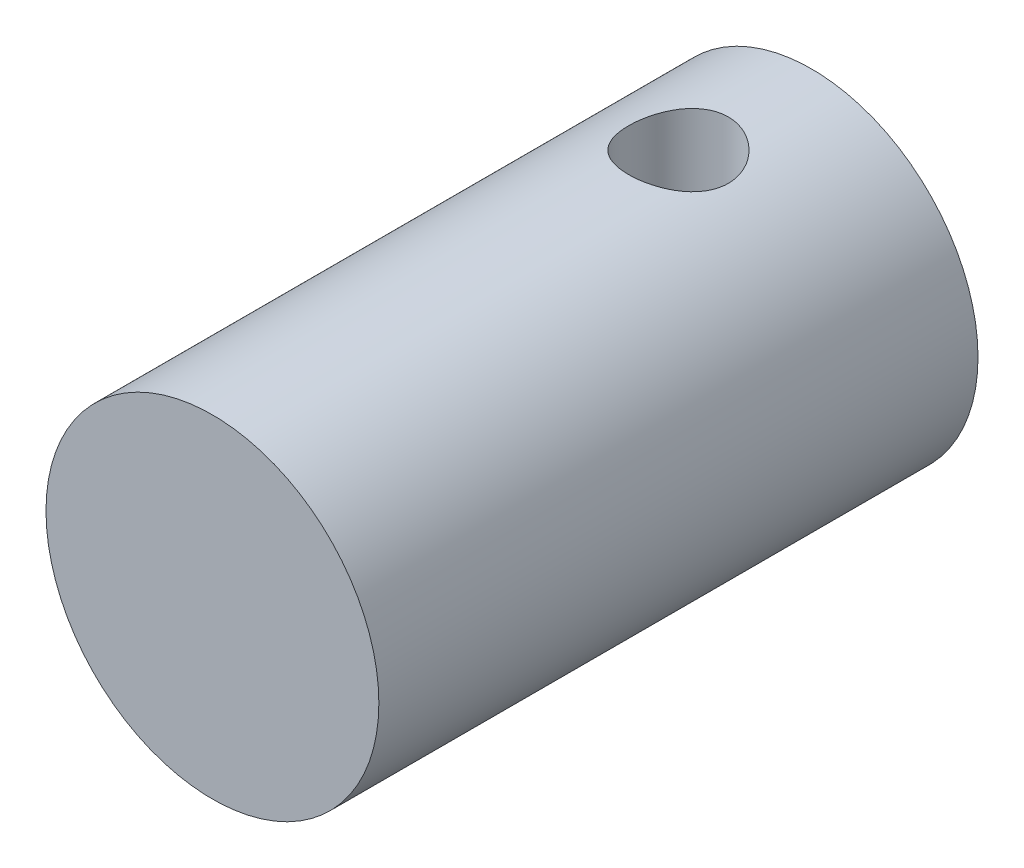
ISO-10303-21;
HEADER;
FILE_DESCRIPTION(('STEP AP214'),'2;1');
FILE_NAME('part.step','',(''),(''),'','','');
FILE_SCHEMA(('AUTOMOTIVE_DESIGN { 1 0 10303 214 1 1 1 1 }'));
ENDSEC;
DATA;
#1=APPLICATION_CONTEXT('core data for automotive mechanical design processes');
#2=APPLICATION_PROTOCOL_DEFINITION('international standard','automotive_design',2000,#1);
#3=PRODUCT_CONTEXT('',#1,'mechanical');
#4=PRODUCT('Part','Part','',(#3));
#5=PRODUCT_RELATED_PRODUCT_CATEGORY('part','',(#4));
#6=PRODUCT_DEFINITION_FORMATION('','',#4);
#7=PRODUCT_DEFINITION_CONTEXT('part definition',#1,'design');
#8=PRODUCT_DEFINITION('design','',#6,#7);
#9=PRODUCT_DEFINITION_SHAPE('','',#8);
#10=(LENGTH_UNIT() NAMED_UNIT(*) SI_UNIT(.MILLI.,.METRE.));
#11=(NAMED_UNIT(*) PLANE_ANGLE_UNIT() SI_UNIT($,.RADIAN.));
#12=(NAMED_UNIT(*) SI_UNIT($,.STERADIAN.) SOLID_ANGLE_UNIT());
#13=UNCERTAINTY_MEASURE_WITH_UNIT(LENGTH_MEASURE(1.E-05),#10,'distance_accuracy_value','');
#14=(GEOMETRIC_REPRESENTATION_CONTEXT(3) GLOBAL_UNCERTAINTY_ASSIGNED_CONTEXT((#13)) GLOBAL_UNIT_ASSIGNED_CONTEXT((#10,
#11,#12)) REPRESENTATION_CONTEXT('',''));
#15=CARTESIAN_POINT('',(0.,0.,0.));
#16=DIRECTION('',(0.,0.,1.));
#17=DIRECTION('',(1.,0.,0.));
#18=AXIS2_PLACEMENT_3D('',#15,#16,#17);
#19=CARTESIAN_POINT('',(-63.2013268027101,37.6957468467203,90.));
#20=DIRECTION('',(0.,0.,-1.));
#21=DIRECTION('',(-1.,0.,0.));
#22=AXIS2_PLACEMENT_3D('',#19,#20,#21);
#23=CYLINDRICAL_SURFACE('',#22,25.);
#24=CARTESIAN_POINT('',(-63.2013268027101,37.6957468467203,90.));
#25=DIRECTION('',(0.,0.,1.));
#26=DIRECTION('',(1.,0.,0.));
#27=AXIS2_PLACEMENT_3D('',#24,#25,#26);
#28=CIRCLE('',#27,25.);
#29=CARTESIAN_POINT('',(-38.2013268027101,37.6957468467203,90.));
#30=VERTEX_POINT('',#29);
#31=EDGE_CURVE('E10',#30,#30,#28,.T.);
#32=ORIENTED_EDGE('',*,*,#31,.F.);
#33=EDGE_LOOP('',(#32));
#34=FACE_BOUND('',#33,.T.);
#35=CARTESIAN_POINT('',(-63.2013268027101,37.6957468467203,0.));
#36=DIRECTION('',(0.,0.,1.));
#37=DIRECTION('',(1.,0.,0.));
#38=AXIS2_PLACEMENT_3D('',#35,#36,#37);
#39=CIRCLE('',#38,25.);
#40=CARTESIAN_POINT('',(-38.2013268027101,37.6957468467203,0.));
#41=VERTEX_POINT('',#40);
#42=EDGE_CURVE('E50',#41,#41,#39,.T.);
#43=ORIENTED_EDGE('',*,*,#42,.T.);
#44=EDGE_LOOP('',(#43));
#45=FACE_BOUND('',#44,.T.);
#46=CARTESIAN_POINT('',(-63.2013268027101,12.6957468467203,12.5));
#47=CARTESIAN_POINT('',(-62.9955974339308,12.695747108011,12.5000004112625));
#48=CARTESIAN_POINT('',(-62.7898609711749,12.6982923799865,12.5084719252444));
#49=CARTESIAN_POINT('',(-62.3798990925537,12.7084038894814,12.5422814878767));
#50=CARTESIAN_POINT('',(-62.1756737460615,12.7159703560873,12.5676203060797));
#51=CARTESIAN_POINT('',(-61.7702096946161,12.7359170074867,12.6349380110206));
#52=CARTESIAN_POINT('',(-61.5689711952961,12.748297522128,12.6769180379808));
#53=CARTESIAN_POINT('',(-61.1708535277715,12.7775398075142,12.7771655388596));
#54=CARTESIAN_POINT('',(-60.9739760012658,12.7944032358162,12.8354390377025));
#55=CARTESIAN_POINT('',(-60.5863607137283,12.832123188169,12.967661042412));
#56=CARTESIAN_POINT('',(-60.39561209458,12.8529721371817,13.0415798403282));
#57=CARTESIAN_POINT('',(-60.0210952750968,12.8981302632539,13.2045680555255));
#58=CARTESIAN_POINT('',(-59.8373297302777,12.9224407403026,13.2936431672761));
#59=CARTESIAN_POINT('',(-59.2984299661546,12.9996209757324,13.5825810978297));
#60=CARTESIAN_POINT('',(-58.9553343096142,13.0567761643035,13.8042794684374));
#61=CARTESIAN_POINT('',(-58.3018705201076,13.1782240134392,14.3061924306261));
#62=CARTESIAN_POINT('',(-57.9925780342825,13.2426630164643,14.5877718736252));
#63=CARTESIAN_POINT('',(-57.5669381295448,13.3385111621154,15.0454820043199));
#64=CARTESIAN_POINT('',(-57.4313710499723,13.3703444554789,15.2040486219919));
#65=CARTESIAN_POINT('',(-57.1738295929157,13.4328779822402,15.5320373219699));
#66=CARTESIAN_POINT('',(-57.0518501791471,13.4635786326127,15.7014553452715));
#67=CARTESIAN_POINT('',(-56.8196695635569,13.5236725580961,16.0541097017446));
#68=CARTESIAN_POINT('',(-56.7098025764061,13.5530197123196,16.2375738131813));
#69=CARTESIAN_POINT('',(-56.5060063094759,13.6087411771104,16.6135013477778));
#70=CARTESIAN_POINT('',(-56.4120711918069,13.6351165754191,16.8059614414353));
#71=CARTESIAN_POINT('',(-56.2408555848165,13.684087676665,17.19862263192));
#72=CARTESIAN_POINT('',(-56.1635751900706,13.7066833581386,17.3988237726978));
#73=CARTESIAN_POINT('',(-56.0263467771995,13.7473692335534,17.805526179363));
#74=CARTESIAN_POINT('',(-55.9663981416651,13.7654595879846,18.0120272205391));
#75=CARTESIAN_POINT('',(-55.8658181678275,13.7961024817296,18.4239310950328));
#76=CARTESIAN_POINT('',(-55.8246932067066,13.8087958228148,18.6292029529461));
#77=CARTESIAN_POINT('',(-55.7597272048449,13.8289549279996,19.0427152159302));
#78=CARTESIAN_POINT('',(-55.7358855497488,13.8364208779125,19.2509555152161));
#79=CARTESIAN_POINT('',(-55.7057174359843,13.845881202646,19.6687832401363));
#80=CARTESIAN_POINT('',(-55.6993874561043,13.8478766774576,19.8783703864527));
#81=CARTESIAN_POINT('',(-55.7042950414286,13.846333385685,20.2973159956704));
#82=CARTESIAN_POINT('',(-55.7155322277404,13.8427947384618,20.5066744634064));
#83=CARTESIAN_POINT('',(-55.7547361602654,13.8305276487439,20.9159742074959));
#84=CARTESIAN_POINT('',(-55.7820803267998,13.8219924106237,21.1159812968494));
#85=CARTESIAN_POINT('',(-55.8527470094262,13.8001459669981,21.5129552347268));
#86=CARTESIAN_POINT('',(-55.8960748551724,13.7868331684864,21.7099210463065));
#87=CARTESIAN_POINT('',(-55.9983224941954,13.7558308588945,22.0993440286104));
#88=CARTESIAN_POINT('',(-56.0572377461535,13.7381426226752,22.2918024947803));
#89=CARTESIAN_POINT('',(-56.1902133060235,13.6988909999937,22.6710838311216));
#90=CARTESIAN_POINT('',(-56.2642793342355,13.677326150258,22.8579045420503));
#91=CARTESIAN_POINT('',(-56.4280637833404,13.6306216310733,23.2271093020035));
#92=CARTESIAN_POINT('',(-56.5179775341871,13.6054381752684,23.4094011215487));
#93=CARTESIAN_POINT('',(-56.7121403458294,13.5524126683426,23.7658551504779));
#94=CARTESIAN_POINT('',(-56.8163943217889,13.5245697066708,23.9400145449099));
#95=CARTESIAN_POINT('',(-57.0385069041628,13.4669868974111,24.2791040345871));
#96=CARTESIAN_POINT('',(-57.1563659343295,13.4372469907526,24.4440338421238));
#97=CARTESIAN_POINT('',(-57.404930997202,13.3766564770987,24.76369509187));
#98=CARTESIAN_POINT('',(-57.5356373941492,13.3458058386281,24.918426244725));
#99=CARTESIAN_POINT('',(-57.8148427301455,13.2824896879976,25.2230496485502));
#100=CARTESIAN_POINT('',(-57.96385826155,13.2500107532923,25.3724660556632));
#101=CARTESIAN_POINT('',(-58.2739599871717,13.1856240243978,25.6582239578863));
#102=CARTESIAN_POINT('',(-58.4350422696507,13.1537160492377,25.7945696577963));
#103=CARTESIAN_POINT('',(-58.7683731251102,13.0913228752525,26.0533844420073));
#104=CARTESIAN_POINT('',(-58.940626598587,13.060838311063,26.1758473706948));
#105=CARTESIAN_POINT('',(-59.2950620180928,13.0021577072717,26.4059125570832));
#106=CARTESIAN_POINT('',(-59.4772400308052,12.9739607719029,26.5135206431883));
#107=CARTESIAN_POINT('',(-59.8517250807065,12.9204326751406,26.7138348498094));
#108=CARTESIAN_POINT('',(-60.0440951375497,12.8951234066688,26.8064291155219));
#109=CARTESIAN_POINT('',(-60.4363540377044,12.8483341252241,26.9749893417834));
#110=CARTESIAN_POINT('',(-60.6362399861585,12.8268526558479,27.0509616291902));
#111=CARTESIAN_POINT('',(-61.0421547500018,12.7883276125686,27.1856593933389));
#112=CARTESIAN_POINT('',(-61.2481833725196,12.7712838994893,27.2443854109631));
#113=CARTESIAN_POINT('',(-61.6648400006953,12.7421336397608,27.3440511345618));
#114=CARTESIAN_POINT('',(-61.8754678380969,12.730026912816,27.384991490061));
#115=CARTESIAN_POINT('',(-62.2920711038689,12.7114485612278,27.4475511606581));
#116=CARTESIAN_POINT('',(-62.4979421924557,12.7047902842955,27.4698111834193));
#117=CARTESIAN_POINT('',(-62.9109198555216,12.6965806013278,27.4972318892954));
#118=CARTESIAN_POINT('',(-63.1180263999355,12.6950290715219,27.5023929868313));
#119=CARTESIAN_POINT('',(-63.5319050532146,12.6970760889938,27.4955686635519));
#120=CARTESIAN_POINT('',(-63.7386771993883,12.7006740154149,27.4835853097995));
#121=CARTESIAN_POINT('',(-64.1503732137564,12.7129183162237,27.4425871577153));
#122=CARTESIAN_POINT('',(-64.3552970950133,12.7215646549038,27.4135724798468));
#123=CARTESIAN_POINT('',(-64.7571546669681,12.7434128857745,27.3396311049056));
#124=CARTESIAN_POINT('',(-64.954163996976,12.7565063822966,27.2950824044168));
#125=CARTESIAN_POINT('',(-65.3437091026506,12.7869455732993,27.1903331953074));
#126=CARTESIAN_POINT('',(-65.5362433546916,12.8042926934463,27.1301274385769));
#127=CARTESIAN_POINT('',(-65.9154505618262,12.8427822984096,26.994574042881));
#128=CARTESIAN_POINT('',(-66.1021250841843,12.8639237580389,26.9192304933182));
#129=CARTESIAN_POINT('',(-66.4685559141294,12.9094740621228,26.7539343959032));
#130=CARTESIAN_POINT('',(-66.6483095831104,12.9338841371764,26.6639763431125));
#131=CARTESIAN_POINT('',(-67.0037363003487,12.9859375808187,26.4679059464763));
#132=CARTESIAN_POINT('',(-67.1792232270303,13.0136419169977,26.361472401944));
#133=CARTESIAN_POINT('',(-67.5207175184221,13.0711075508809,26.1347280654955));
#134=CARTESIAN_POINT('',(-67.6867215768243,13.100869558117,26.0144124770717));
#135=CARTESIAN_POINT('',(-68.0081952100468,13.1616729458461,25.7607242511056));
#136=CARTESIAN_POINT('',(-68.1636642493753,13.1927143912437,25.6273509506849));
#137=CARTESIAN_POINT('',(-68.46312960672,13.255271498429,25.348393039342));
#138=CARTESIAN_POINT('',(-68.6071257035207,13.2867871693465,25.202808193074));
#139=CARTESIAN_POINT('',(-68.8878122121842,13.3506168932327,24.894779861594));
#140=CARTESIAN_POINT('',(-69.0240432323072,13.3829180248464,24.7319146788211));
#141=CARTESIAN_POINT('',(-69.2822751865641,13.4462161294408,24.3951201087598));
#142=CARTESIAN_POINT('',(-69.4042809174817,13.4772135397708,24.2211944818166));
#143=CARTESIAN_POINT('',(-69.6332960149577,13.5370260711218,23.8632790647772));
#144=CARTESIAN_POINT('',(-69.7402996651257,13.5658403583743,23.6792854753124));
#145=CARTESIAN_POINT('',(-69.9384036238113,13.6203994222174,23.3025842463297));
#146=CARTESIAN_POINT('',(-70.0295104663149,13.6461454585501,23.1098802282167));
#147=CARTESIAN_POINT('',(-70.1947782045566,13.6936843281958,22.7178470275202));
#148=CARTESIAN_POINT('',(-70.2690100754981,13.7154936362569,22.5185497897928));
#149=CARTESIAN_POINT('',(-70.4003561921086,13.7545965946545,22.1140423381271));
#150=CARTESIAN_POINT('',(-70.4574771755127,13.7718920220705,21.9088344865881));
#151=CARTESIAN_POINT('',(-70.5541091167229,13.8014138580361,21.4939710842057));
#152=CARTESIAN_POINT('',(-70.5936216572219,13.8136407221546,21.2843159348725));
#153=CARTESIAN_POINT('',(-70.654658917241,13.8326190740685,20.8621602230154));
#154=CARTESIAN_POINT('',(-70.6761843221537,13.8393707704926,20.6496597692243));
#155=CARTESIAN_POINT('',(-70.7005157682562,13.8470086000164,20.2323894168999));
#156=CARTESIAN_POINT('',(-70.7040651519327,13.8481276415819,20.0276667726657));
#157=CARTESIAN_POINT('',(-70.6944183026481,13.845094729384,19.6186566305787));
#158=CARTESIAN_POINT('',(-70.6812223185737,13.8409428539623,19.4143691263037));
#159=CARTESIAN_POINT('',(-70.6382087329973,13.8274982273256,19.0077365103332));
#160=CARTESIAN_POINT('',(-70.6083920056289,13.8182057464703,18.8053912970562));
#161=CARTESIAN_POINT('',(-70.5324081326086,13.794767283605,18.4040824484149));
#162=CARTESIAN_POINT('',(-70.4862409110428,13.7806212790605,18.2051188287555));
#163=CARTESIAN_POINT('',(-70.3786439988405,13.7481116671036,17.8144449801132));
#164=CARTESIAN_POINT('',(-70.317414636119,13.7298036398133,17.6226748519841));
#165=CARTESIAN_POINT('',(-70.1798783427527,13.6893944973931,17.244963027346));
#166=CARTESIAN_POINT('',(-70.1035663605265,13.6672921117557,17.0590233078415));
#167=CARTESIAN_POINT('',(-69.9364693751069,13.6199210158073,16.694232849456));
#168=CARTESIAN_POINT('',(-69.8456871471616,13.5946529128475,16.5153807594349));
#169=CARTESIAN_POINT('',(-69.6502448816278,13.5416228230554,16.1657354366646));
#170=CARTESIAN_POINT('',(-69.5455798826076,13.5138599457887,15.9949451147601));
#171=CARTESIAN_POINT('',(-69.3190478311056,13.4555394275603,15.656446987065));
#172=CARTESIAN_POINT('',(-69.1966946116978,13.4249169480947,15.4890755589508));
#173=CARTESIAN_POINT('',(-68.9386649275107,13.3626302854606,15.1651440310784));
#174=CARTESIAN_POINT('',(-68.802988109558,13.3309660746934,15.0085842180949));
#175=CARTESIAN_POINT('',(-68.5191163938813,13.2674380251865,14.7071757957806));
#176=CARTESIAN_POINT('',(-68.3709163697093,13.2355741096865,14.562332030434));
#177=CARTESIAN_POINT('',(-68.0630158762154,13.1725198564665,14.2853835022133));
#178=CARTESIAN_POINT('',(-67.9033192671986,13.1413292971786,14.1532744978109));
#179=CARTESIAN_POINT('',(-67.5684578460502,13.079532682713,13.8988789845925));
#180=CARTESIAN_POINT('',(-67.3929746828869,13.0489714237631,13.7770001817583));
#181=CARTESIAN_POINT('',(-67.0320200843291,12.9902979804543,13.5485356366457));
#182=CARTESIAN_POINT('',(-66.8465523058934,12.9621849091668,13.4419443468825));
#183=CARTESIAN_POINT('',(-66.466857656197,12.9091972466788,13.244849931559));
#184=CARTESIAN_POINT('',(-66.2726325456454,12.8843220083689,13.1543435899559));
#185=CARTESIAN_POINT('',(-65.8767576058818,12.838519407473,12.9901514004289));
#186=CARTESIAN_POINT('',(-65.6751084953352,12.8175916639524,12.9164639293341));
#187=CARTESIAN_POINT('',(-65.2878092993404,12.7822915665747,12.7935214289626));
#188=CARTESIAN_POINT('',(-65.1027617973027,12.7674569459212,12.7424939325794));
#189=CARTESIAN_POINT('',(-64.7290398681018,12.741765913242,12.6547342900006));
#190=CARTESIAN_POINT('',(-64.5403656604146,12.7309092612755,12.6180012815905));
#191=CARTESIAN_POINT('',(-64.1605494719846,12.7134324217152,12.559111214488));
#192=CARTESIAN_POINT('',(-63.969407351971,12.7068124742849,12.5369549820987));
#193=CARTESIAN_POINT('',(-63.5859541973392,12.6979703411762,12.5074017886911));
#194=CARTESIAN_POINT('',(-63.3936435995958,12.6957466024644,12.4999996155498));
#195=CARTESIAN_POINT('',(-63.2013268027101,12.6957468467203,12.5));
#196=B_SPLINE_CURVE_WITH_KNOTS('',3,(#46,#47,#48,#49,#50,#51,#52,#53,#54,#55,#56,#57,#58,#59,
#60,#61,#62,#63,#64,#65,#66,#67,#68,#69,#70,#71,#72,#73,#74,#75,#76,#77,#78,#79,#80,#81,#82,#83,
#84,#85,#86,#87,#88,#89,#90,#91,#92,#93,#94,#95,#96,#97,#98,#99,#100,#101,#102,#103,#104,#105,
#106,#107,#108,#109,#110,#111,#112,#113,#114,#115,#116,#117,#118,#119,#120,#121,#122,#123,#124,
#125,#126,#127,#128,#129,#130,#131,#132,#133,#134,#135,#136,#137,#138,#139,#140,#141,#142,#143,
#144,#145,#146,#147,#148,#149,#150,#151,#152,#153,#154,#155,#156,#157,#158,#159,#160,#161,#162,
#163,#164,#165,#166,#167,#168,#169,#170,#171,#172,#173,#174,#175,#176,#177,#178,#179,#180,#181,
#182,#183,#184,#185,#186,#187,#188,#189,#190,#191,#192,#193,#194,#195),.UNSPECIFIED.,.T.,.F.,(4,
2,2,2,2,2,2,2,2,2,2,2,2,2,2,2,2,2,2,2,2,2,2,2,2,2,2,2,2,2,2,2,2,2,2,2,2,2,2,2,2,2,2,2,2,2,2,2,2,
2,2,2,2,2,2,2,2,2,2,2,2,2,2,2,2,2,2,2,2,2,2,2,2,2,4),(0.,0.617011014084921,1.23405018056197,
1.85113163263338,2.46844156866762,3.08458968130544,3.70096980389295,4.93260224445208,
6.19608156979814,6.82858532893179,7.4608538641903,8.10762051119977,8.75414965009407,
9.40068246026767,10.0471922361636,10.6756103415585,11.304006108008,11.9322755087511,
12.5605313590348,13.1659639935605,13.7715986884165,14.3770571283423,14.9827445874104,
15.5964989646348,16.2104642350319,16.8244486335694,17.4384504444769,18.0782287707322,
18.7178005870157,19.357654888987,19.9972574216116,20.6414255082747,21.2853479756983,
21.9292502460878,22.573128999469,23.1938985328161,23.8146530206626,24.4353326720282,
25.0560079333493,25.6625274932798,26.2692506159497,26.8758100551044,27.4825985028951,
28.1032039409232,28.7240244556025,29.3448765027644,29.9657405179864,30.6092972595381,
31.2526363615572,31.8962199390125,32.5395383611583,33.1800987847127,33.8204066429376,
34.4606569370019,35.1008828334693,35.7144046773518,36.3279174025609,36.9413978643795,
37.5548811745697,38.1606087791624,38.7665396033302,39.3723543555586,39.9783862004705,
40.6063948225765,41.234420096027,41.8627037124137,42.4907773399551,43.1374850516323,
43.7839574910374,44.4303005282366,45.0765811611782,45.6535719780474,46.2305279866003,
46.8075166978202,47.3843015417932),.UNSPECIFIED.);
#197=CARTESIAN_POINT('',(-63.2013268027101,12.6957468467203,12.5));
#198=VERTEX_POINT('',#197);
#199=EDGE_CURVE('E57',#198,#198,#196,.T.);
#200=ORIENTED_EDGE('',*,*,#199,.F.);
#201=EDGE_LOOP('',(#200));
#202=FACE_BOUND('',#201,.T.);
#203=CARTESIAN_POINT('',(-63.2013268027101,62.6957468467203,12.5));
#204=CARTESIAN_POINT('',(-63.4070561714894,62.6957465854295,12.5000004112625));
#205=CARTESIAN_POINT('',(-63.6127926342454,62.6932013134541,12.5084719252444));
#206=CARTESIAN_POINT('',(-64.0227545128665,62.6830898039592,12.5422814878767));
#207=CARTESIAN_POINT('',(-64.2269798593587,62.6755233373532,12.5676203060797));
#208=CARTESIAN_POINT('',(-64.6324439108041,62.6555766859538,12.6349380110206));
#209=CARTESIAN_POINT('',(-64.8336824101241,62.6431961713125,12.6769180379807));
#210=CARTESIAN_POINT('',(-65.2318000776488,62.6139538859263,12.7771655388596));
#211=CARTESIAN_POINT('',(-65.4286776041544,62.5970904576243,12.8354390377025));
#212=CARTESIAN_POINT('',(-65.8162928916919,62.5593705052715,12.967661042412));
#213=CARTESIAN_POINT('',(-66.0070415108402,62.5385215562588,13.0415798403282));
#214=CARTESIAN_POINT('',(-66.3815583303234,62.4933634301866,13.2045680555255));
#215=CARTESIAN_POINT('',(-66.5653238751425,62.4690529531379,13.2936431672761));
#216=CARTESIAN_POINT('',(-67.1042236392656,62.3918727177082,13.5825810978297));
#217=CARTESIAN_POINT('',(-67.447319295806,62.334717529137,13.8042794684374));
#218=CARTESIAN_POINT('',(-68.1007830853126,62.2132696800014,14.3061924306261));
#219=CARTESIAN_POINT('',(-68.4100755711377,62.1488306769763,14.5877718736252));
#220=CARTESIAN_POINT('',(-68.8357154758754,62.0529825313251,15.0454820043199));
#221=CARTESIAN_POINT('',(-68.9712825554479,62.0211492379617,15.2040486219919));
#222=CARTESIAN_POINT('',(-69.2288240125045,61.9586157112003,15.5320373219699));
#223=CARTESIAN_POINT('',(-69.3508034262731,61.9279150608278,15.7014553452715));
#224=CARTESIAN_POINT('',(-69.5829840418633,61.8678211353445,16.0541097017446));
#225=CARTESIAN_POINT('',(-69.6928510290142,61.8384739811209,16.2375738131813));
#226=CARTESIAN_POINT('',(-69.8966472959443,61.7827525163301,16.6135013477778));
#227=CARTESIAN_POINT('',(-69.9905824136134,61.7563771180214,16.8059614414353));
#228=CARTESIAN_POINT('',(-70.1617980206037,61.7074060167755,17.19862263192));
#229=CARTESIAN_POINT('',(-70.2390784153497,61.6848103353019,17.3988237726978));
#230=CARTESIAN_POINT('',(-70.3763068282207,61.6441244598872,17.8055261793629));
#231=CARTESIAN_POINT('',(-70.4362554637551,61.626034105456,18.0120272205391));
#232=CARTESIAN_POINT('',(-70.5368354375927,61.5953912117109,18.4239310950328));
#233=CARTESIAN_POINT('',(-70.5779603987136,61.5826978706257,18.6292029529461));
#234=CARTESIAN_POINT('',(-70.6429264005754,61.562538765441,19.0427152159302));
#235=CARTESIAN_POINT('',(-70.6667680556714,61.5550728155281,19.2509555152161));
#236=CARTESIAN_POINT('',(-70.696936169436,61.5456124907946,19.6687832401363));
#237=CARTESIAN_POINT('',(-70.7032661493159,61.5436170159829,19.8783703864527));
#238=CARTESIAN_POINT('',(-70.6983585639917,61.5451603077555,20.2973159956704));
#239=CARTESIAN_POINT('',(-70.6871213776798,61.5486989549787,20.5066744634064));
#240=CARTESIAN_POINT('',(-70.6479174451548,61.5609660446967,20.9159742074959));
#241=CARTESIAN_POINT('',(-70.6205732786204,61.5695012828168,21.1159812968494));
#242=CARTESIAN_POINT('',(-70.549906595994,61.5913477264424,21.5129552347268));
#243=CARTESIAN_POINT('',(-70.5065787502478,61.6046605249541,21.7099210463065));
#244=CARTESIAN_POINT('',(-70.4043311112249,61.6356628345461,22.0993440286103));
#245=CARTESIAN_POINT('',(-70.3454158592667,61.6533510707654,22.2918024947802));
#246=CARTESIAN_POINT('',(-70.2124402993967,61.6926026934469,22.6710838311216));
#247=CARTESIAN_POINT('',(-70.1383742711847,61.7141675431826,22.8579045420503));
#248=CARTESIAN_POINT('',(-69.9745898220798,61.7608720623672,23.2271093020035));
#249=CARTESIAN_POINT('',(-69.8846760712331,61.7860555181721,23.4094011215487));
#250=CARTESIAN_POINT('',(-69.6905132595908,61.8390810250979,23.7658551504779));
#251=CARTESIAN_POINT('',(-69.5862592836313,61.8669239867698,23.9400145449099));
#252=CARTESIAN_POINT('',(-69.3641467012574,61.9245067960295,24.2791040345871));
#253=CARTESIAN_POINT('',(-69.2462876710908,61.954246702688,24.4440338421237));
#254=CARTESIAN_POINT('',(-68.9977226082183,62.0148372163419,24.7636950918699));
#255=CARTESIAN_POINT('',(-68.867016211271,62.0456878548124,24.918426244725));
#256=CARTESIAN_POINT('',(-68.5878108752748,62.109004005443,25.2230496485502));
#257=CARTESIAN_POINT('',(-68.4387953438703,62.1414829401482,25.3724660556632));
#258=CARTESIAN_POINT('',(-68.1286936182486,62.2058696690427,25.6582239578862));
#259=CARTESIAN_POINT('',(-67.9676113357696,62.2377776442028,25.7945696577963));
#260=CARTESIAN_POINT('',(-67.6342804803101,62.300170818188,26.0533844420073));
#261=CARTESIAN_POINT('',(-67.4620270068333,62.3306553823775,26.1758473706948));
#262=CARTESIAN_POINT('',(-67.1075915873275,62.3893359861688,26.4059125570832));
#263=CARTESIAN_POINT('',(-66.925413574615,62.4175329215377,26.5135206431882));
#264=CARTESIAN_POINT('',(-66.5509285247138,62.4710610182999,26.7138348498094));
#265=CARTESIAN_POINT('',(-66.3585584678706,62.4963702867717,26.8064291155219));
#266=CARTESIAN_POINT('',(-65.9662995677158,62.5431595682165,26.9749893417834));
#267=CARTESIAN_POINT('',(-65.7664136192617,62.5646410375927,27.0509616291902));
#268=CARTESIAN_POINT('',(-65.3604988554184,62.603166080872,27.1856593933389));
#269=CARTESIAN_POINT('',(-65.1544702329007,62.6202097939513,27.2443854109631));
#270=CARTESIAN_POINT('',(-64.7378136047249,62.6493600536798,27.3440511345618));
#271=CARTESIAN_POINT('',(-64.5271857673233,62.6614667806245,27.384991490061));
#272=CARTESIAN_POINT('',(-64.1105825015513,62.6800451322128,27.4475511606581));
#273=CARTESIAN_POINT('',(-63.9047114129646,62.686703409145,27.4698111834193));
#274=CARTESIAN_POINT('',(-63.4917337498987,62.6949130921127,27.4972318892954));
#275=CARTESIAN_POINT('',(-63.2846272054848,62.6964646219187,27.5023929868313));
#276=CARTESIAN_POINT('',(-62.8707485522057,62.6944176044467,27.4955686635519));
#277=CARTESIAN_POINT('',(-62.663976406032,62.6908196780257,27.4835853097996));
#278=CARTESIAN_POINT('',(-62.2522803916638,62.6785753772169,27.4425871577153));
#279=CARTESIAN_POINT('',(-62.047356510407,62.6699290385367,27.4135724798468));
#280=CARTESIAN_POINT('',(-61.6454989384521,62.648080807666,27.3396311049056));
#281=CARTESIAN_POINT('',(-61.4484896084442,62.634987311144,27.2950824044168));
#282=CARTESIAN_POINT('',(-61.0589445027697,62.6045481201413,27.1903331953074));
#283=CARTESIAN_POINT('',(-60.8664102507286,62.5872009999942,27.1301274385769));
#284=CARTESIAN_POINT('',(-60.487203043594,62.5487113950309,26.994574042881));
#285=CARTESIAN_POINT('',(-60.3005285212359,62.5275699354017,26.9192304933182));
#286=CARTESIAN_POINT('',(-59.9340976912909,62.4820196313177,26.7539343959032));
#287=CARTESIAN_POINT('',(-59.7543440223098,62.4576095562641,26.6639763431125));
#288=CARTESIAN_POINT('',(-59.3989173050715,62.4055561126219,26.4679059464763));
#289=CARTESIAN_POINT('',(-59.2234303783899,62.3778517764428,26.361472401944));
#290=CARTESIAN_POINT('',(-58.8819360869981,62.3203861425596,26.1347280654955));
#291=CARTESIAN_POINT('',(-58.7159320285959,62.2906241353236,26.0144124770717));
#292=CARTESIAN_POINT('',(-58.3944583953734,62.2298207475945,25.7607242511056));
#293=CARTESIAN_POINT('',(-58.2389893560449,62.1987793021969,25.6273509506849));
#294=CARTESIAN_POINT('',(-57.9395239987002,62.1362221950115,25.348393039342));
#295=CARTESIAN_POINT('',(-57.7955279018995,62.104706524094,25.202808193074));
#296=CARTESIAN_POINT('',(-57.514841393236,62.0408768002078,24.894779861594));
#297=CARTESIAN_POINT('',(-57.3786103731131,62.0085756685942,24.7319146788211));
#298=CARTESIAN_POINT('',(-57.1203784188561,61.9452775639998,24.3951201087598));
#299=CARTESIAN_POINT('',(-56.9983726879385,61.9142801536698,24.2211944818166));
#300=CARTESIAN_POINT('',(-56.7693575904625,61.8544676223188,23.8632790647772));
#301=CARTESIAN_POINT('',(-56.6623539402946,61.8256533350663,23.6792854753124));
#302=CARTESIAN_POINT('',(-56.4642499816089,61.7710942712231,23.3025842463297));
#303=CARTESIAN_POINT('',(-56.3731431391053,61.7453482348904,23.1098802282167));
#304=CARTESIAN_POINT('',(-56.2078754008636,61.6978093652447,22.7178470275203));
#305=CARTESIAN_POINT('',(-56.1336435299222,61.6760000571837,22.5185497897929));
#306=CARTESIAN_POINT('',(-56.0022974133116,61.6368970987861,22.1140423381271));
#307=CARTESIAN_POINT('',(-55.9451764299075,61.6196016713701,21.9088344865881));
#308=CARTESIAN_POINT('',(-55.8485444886973,61.5900798354044,21.4939710842058));
#309=CARTESIAN_POINT('',(-55.8090319481983,61.5778529712859,21.2843159348725));
#310=CARTESIAN_POINT('',(-55.7479946881792,61.5588746193721,20.8621602230154));
#311=CARTESIAN_POINT('',(-55.7264692832665,61.5521229229479,20.6496597692243));
#312=CARTESIAN_POINT('',(-55.702137837164,61.5444850934241,20.2323894168999));
#313=CARTESIAN_POINT('',(-55.6985884534876,61.5433660518587,20.0276667726657));
#314=CARTESIAN_POINT('',(-55.7082353027721,61.5463989640566,19.6186566305787));
#315=CARTESIAN_POINT('',(-55.7214312868465,61.5505508394783,19.4143691263037));
#316=CARTESIAN_POINT('',(-55.7644448724229,61.563995466115,19.0077365103332));
#317=CARTESIAN_POINT('',(-55.7942615997913,61.5732879469703,18.8053912970562));
#318=CARTESIAN_POINT('',(-55.8702454728116,61.5967264098356,18.4040824484149));
#319=CARTESIAN_POINT('',(-55.9164126943774,61.61087241438,18.2051188287555));
#320=CARTESIAN_POINT('',(-56.0240096065797,61.6433820263369,17.8144449801132));
#321=CARTESIAN_POINT('',(-56.0852389693012,61.6616900536273,17.6226748519841));
#322=CARTESIAN_POINT('',(-56.2227752626675,61.7020991960475,17.244963027346));
#323=CARTESIAN_POINT('',(-56.2990872448937,61.7242015816848,17.0590233078415));
#324=CARTESIAN_POINT('',(-56.4661842303133,61.7715726776332,16.694232849456));
#325=CARTESIAN_POINT('',(-56.5569664582586,61.796840780593,16.515380759435));
#326=CARTESIAN_POINT('',(-56.7524087237924,61.8498708703852,16.1657354366646));
#327=CARTESIAN_POINT('',(-56.8570737228126,61.8776337476518,15.9949451147601));
#328=CARTESIAN_POINT('',(-57.0836057743146,61.9359542658802,15.656446987065));
#329=CARTESIAN_POINT('',(-57.2059589937224,61.9665767453459,15.4890755589508));
#330=CARTESIAN_POINT('',(-57.4639886779095,62.02886340798,15.1651440310784));
#331=CARTESIAN_POINT('',(-57.5996654958622,62.0605276187472,15.0085842180949));
#332=CARTESIAN_POINT('',(-57.8835372115389,62.124055668254,14.7071757957806));
#333=CARTESIAN_POINT('',(-58.0317372357109,62.1559195837541,14.562332030434));
#334=CARTESIAN_POINT('',(-58.3396377292048,62.2189738369741,14.2853835022133));
#335=CARTESIAN_POINT('',(-58.4993343382216,62.250164396262,14.1532744978109));
#336=CARTESIAN_POINT('',(-58.83419575937,62.3119610107275,13.8988789845925));
#337=CARTESIAN_POINT('',(-59.0096789225333,62.3425222696775,13.7770001817583));
#338=CARTESIAN_POINT('',(-59.3706335210911,62.4011957129863,13.5485356366457));
#339=CARTESIAN_POINT('',(-59.5561012995268,62.4293087842737,13.4419443468825));
#340=CARTESIAN_POINT('',(-59.9357959492232,62.4822964467618,13.244849931559));
#341=CARTESIAN_POINT('',(-60.1300210597748,62.5071716850716,13.1543435899559));
#342=CARTESIAN_POINT('',(-60.5258959995383,62.5529742859675,12.9901514004289));
#343=CARTESIAN_POINT('',(-60.727545110085,62.5739020294881,12.9164639293341));
#344=CARTESIAN_POINT('',(-61.1148443060798,62.6092021268659,12.7935214289626));
#345=CARTESIAN_POINT('',(-61.2998918081174,62.6240367475194,12.7424939325794));
#346=CARTESIAN_POINT('',(-61.6736137373184,62.6497277801986,12.6547342900006));
#347=CARTESIAN_POINT('',(-61.8622879450056,62.660584432165,12.6180012815905));
#348=CARTESIAN_POINT('',(-62.2421041334356,62.6780612717253,12.559111214488));
#349=CARTESIAN_POINT('',(-62.4332462534492,62.6846812191556,12.5369549820987));
#350=CARTESIAN_POINT('',(-62.816699408081,62.6935233522643,12.5074017886911));
#351=CARTESIAN_POINT('',(-63.0090100058244,62.6957470909761,12.4999996155498));
#352=CARTESIAN_POINT('',(-63.2013268027101,62.6957468467203,12.5));
#353=B_SPLINE_CURVE_WITH_KNOTS('',3,(#203,#204,#205,#206,#207,#208,#209,#210,#211,#212,#213,
#214,#215,#216,#217,#218,#219,#220,#221,#222,#223,#224,#225,#226,#227,#228,#229,#230,#231,#232,
#233,#234,#235,#236,#237,#238,#239,#240,#241,#242,#243,#244,#245,#246,#247,#248,#249,#250,#251,
#252,#253,#254,#255,#256,#257,#258,#259,#260,#261,#262,#263,#264,#265,#266,#267,#268,#269,#270,
#271,#272,#273,#274,#275,#276,#277,#278,#279,#280,#281,#282,#283,#284,#285,#286,#287,#288,#289,
#290,#291,#292,#293,#294,#295,#296,#297,#298,#299,#300,#301,#302,#303,#304,#305,#306,#307,#308,
#309,#310,#311,#312,#313,#314,#315,#316,#317,#318,#319,#320,#321,#322,#323,#324,#325,#326,#327,
#328,#329,#330,#331,#332,#333,#334,#335,#336,#337,#338,#339,#340,#341,#342,#343,#344,#345,#346,
#347,#348,#349,#350,#351,#352),.UNSPECIFIED.,.T.,.F.,(4,2,2,2,2,2,2,2,2,2,2,2,2,2,2,2,2,2,2,2,2,
2,2,2,2,2,2,2,2,2,2,2,2,2,2,2,2,2,2,2,2,2,2,2,2,2,2,2,2,2,2,2,2,2,2,2,2,2,2,2,2,2,2,2,2,2,2,2,2,
2,2,2,2,2,4),(0.,0.617011014084921,1.23405018056197,1.85113163263337,2.46844156866762,
3.08458968130542,3.70096980389294,4.93260224445208,6.19608156979814,6.82858532893178,
7.46085386419029,8.10762051119976,8.75414965009406,9.40068246026766,10.0471922361636,
10.6756103415585,11.3040061080079,11.9322755087511,12.5605313590348,13.1659639935605,
13.7715986884165,14.3770571283422,14.9827445874104,15.5964989646348,16.2104642350319,
16.8244486335694,17.4384504444769,18.0782287707322,18.7178005870157,19.357654888987,
19.9972574216116,20.6414255082747,21.2853479756983,21.9292502460877,22.573128999469,
23.193898532816,23.8146530206626,24.4353326720282,25.0560079333493,25.6625274932798,
26.2692506159497,26.8758100551044,27.4825985028951,28.1032039409232,28.7240244556025,
29.3448765027644,29.9657405179864,30.609297259538,31.2526363615572,31.8962199390124,
32.5395383611583,33.1800987847127,33.8204066429375,34.4606569370019,35.1008828334693,
35.7144046773518,36.3279174025609,36.9413978643795,37.5548811745697,38.1606087791624,
38.7665396033302,39.3723543555586,39.9783862004705,40.6063948225765,41.2344200960269,
41.8627037124137,42.4907773399551,43.1374850516323,43.7839574910374,44.4303005282366,
45.0765811611782,45.6535719780474,46.2305279866003,46.8075166978202,47.3843015417932),.UNSPECIFIED.);
#354=CARTESIAN_POINT('',(-63.2013268027101,62.6957468467203,12.5));
#355=VERTEX_POINT('',#354);
#356=EDGE_CURVE('E41',#355,#355,#353,.T.);
#357=ORIENTED_EDGE('',*,*,#356,.F.);
#358=EDGE_LOOP('',(#357));
#359=FACE_BOUND('',#358,.T.);
#360=ADVANCED_FACE('F37',(#34,#45,#202,#359),#23,.T.);
#361=CARTESIAN_POINT('',(-63.2013268027101,37.6957468467203,90.));
#362=DIRECTION('',(0.,0.,1.));
#363=DIRECTION('',(1.,0.,0.));
#364=AXIS2_PLACEMENT_3D('',#361,#362,#363);
#365=PLANE('',#364);
#366=ORIENTED_EDGE('',*,*,#31,.T.);
#367=EDGE_LOOP('',(#366));
#368=FACE_BOUND('',#367,.T.);
#369=ADVANCED_FACE('F69',(#368),#365,.T.);
#370=CARTESIAN_POINT('',(-63.2013268027101,37.6957468467203,0.));
#371=DIRECTION('',(0.,0.,1.));
#372=DIRECTION('',(1.,0.,0.));
#373=AXIS2_PLACEMENT_3D('',#370,#371,#372);
#374=PLANE('',#373);
#375=ORIENTED_EDGE('',*,*,#42,.F.);
#376=EDGE_LOOP('',(#375));
#377=FACE_BOUND('',#376,.T.);
#378=ADVANCED_FACE('F67',(#377),#374,.F.);
#379=CARTESIAN_POINT('',(-63.2013268027101,101.,20.));
#380=DIRECTION('',(0.,-1.,0.));
#381=DIRECTION('',(0.,0.,-1.));
#382=AXIS2_PLACEMENT_3D('',#379,#380,#381);
#383=CYLINDRICAL_SURFACE('',#382,7.5);
#384=ORIENTED_EDGE('',*,*,#199,.T.);
#385=EDGE_LOOP('',(#384));
#386=FACE_BOUND('',#385,.T.);
#387=ORIENTED_EDGE('',*,*,#356,.T.);
#388=EDGE_LOOP('',(#387));
#389=FACE_BOUND('',#388,.T.);
#390=ADVANCED_FACE('F63',(#386,#389),#383,.F.);
#391=CLOSED_SHELL('',(#360,#369,#378,#390));
#392=MANIFOLD_SOLID_BREP('B2',#391);
#393=ADVANCED_BREP_SHAPE_REPRESENTATION('',(#18,#392),#14);
#394=SHAPE_DEFINITION_REPRESENTATION(#9,#393);
ENDSEC;
END-ISO-10303-21;
